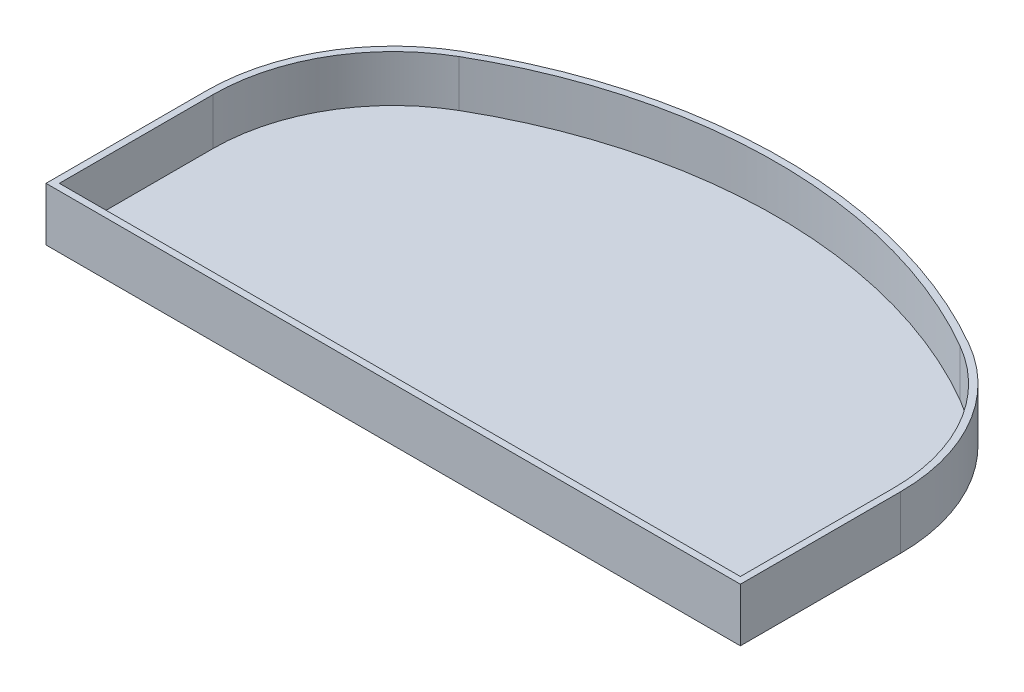
ISO-10303-21;
HEADER;
FILE_DESCRIPTION(('STEP AP214'),'2;1');
FILE_NAME('part.step','',(''),(''),'','','');
FILE_SCHEMA(('AUTOMOTIVE_DESIGN { 1 0 10303 214 1 1 1 1 }'));
ENDSEC;
DATA;
#1=APPLICATION_CONTEXT('core data for automotive mechanical design processes');
#2=APPLICATION_PROTOCOL_DEFINITION('international standard','automotive_design',2000,#1);
#3=PRODUCT_CONTEXT('',#1,'mechanical');
#4=PRODUCT('Part','Part','',(#3));
#5=PRODUCT_RELATED_PRODUCT_CATEGORY('part','',(#4));
#6=PRODUCT_DEFINITION_FORMATION('','',#4);
#7=PRODUCT_DEFINITION_CONTEXT('part definition',#1,'design');
#8=PRODUCT_DEFINITION('design','',#6,#7);
#9=PRODUCT_DEFINITION_SHAPE('','',#8);
#10=(LENGTH_UNIT() NAMED_UNIT(*) SI_UNIT(.MILLI.,.METRE.));
#11=(NAMED_UNIT(*) PLANE_ANGLE_UNIT() SI_UNIT($,.RADIAN.));
#12=(NAMED_UNIT(*) SI_UNIT($,.STERADIAN.) SOLID_ANGLE_UNIT());
#13=UNCERTAINTY_MEASURE_WITH_UNIT(LENGTH_MEASURE(1.E-05),#10,'distance_accuracy_value','');
#14=(GEOMETRIC_REPRESENTATION_CONTEXT(3) GLOBAL_UNCERTAINTY_ASSIGNED_CONTEXT((#13)) GLOBAL_UNIT_ASSIGNED_CONTEXT((#10,
#11,#12)) REPRESENTATION_CONTEXT('',''));
#15=CARTESIAN_POINT('',(0.,0.,0.));
#16=DIRECTION('',(0.,0.,1.));
#17=DIRECTION('',(1.,0.,0.));
#18=AXIS2_PLACEMENT_3D('',#15,#16,#17);
#19=CARTESIAN_POINT('',(0.,25.4,0.));
#20=DIRECTION('',(1.,0.,0.));
#21=DIRECTION('',(0.,0.,-1.));
#22=AXIS2_PLACEMENT_3D('',#19,#20,#21);
#23=PLANE('',#22);
#24=DIRECTION('',(0.,0.,1.));
#25=VECTOR('',#24,1.);
#26=CARTESIAN_POINT('',(0.,0.,0.));
#27=LINE('',#26,#25);
#28=CARTESIAN_POINT('',(0.,0.,-76.2));
#29=VERTEX_POINT('',#28);
#30=CARTESIAN_POINT('',(0.,0.,0.));
#31=VERTEX_POINT('',#30);
#32=EDGE_CURVE('E139',#29,#31,#27,.T.);
#33=ORIENTED_EDGE('',*,*,#32,.T.);
#34=DIRECTION('',(0.,-1.,0.));
#35=VECTOR('',#34,1.);
#36=CARTESIAN_POINT('',(0.,25.4,0.));
#37=LINE('',#36,#35);
#38=CARTESIAN_POINT('',(0.,25.4,0.));
#39=VERTEX_POINT('',#38);
#40=EDGE_CURVE('E11',#39,#31,#37,.T.);
#41=ORIENTED_EDGE('',*,*,#40,.F.);
#42=DIRECTION('',(0.,0.,1.));
#43=VECTOR('',#42,1.);
#44=CARTESIAN_POINT('',(0.,25.4,0.));
#45=LINE('',#44,#43);
#46=CARTESIAN_POINT('',(0.,25.4,-76.2));
#47=VERTEX_POINT('',#46);
#48=EDGE_CURVE('E157',#47,#39,#45,.T.);
#49=ORIENTED_EDGE('',*,*,#48,.F.);
#50=DIRECTION('',(0.,-1.,0.));
#51=VECTOR('',#50,1.);
#52=CARTESIAN_POINT('',(0.,25.4,-76.2));
#53=LINE('',#52,#51);
#54=EDGE_CURVE('E135',#47,#29,#53,.T.);
#55=ORIENTED_EDGE('',*,*,#54,.T.);
#56=EDGE_LOOP('',(#33,#41,#49,#55));
#57=FACE_BOUND('',#56,.T.);
#58=ADVANCED_FACE('F39',(#57),#23,.F.);
#59=CARTESIAN_POINT('',(0.,25.4,0.));
#60=DIRECTION('',(0.,0.,-1.));
#61=DIRECTION('',(-1.,0.,0.));
#62=AXIS2_PLACEMENT_3D('',#59,#60,#61);
#63=PLANE('',#62);
#64=DIRECTION('',(1.,0.,0.));
#65=VECTOR('',#64,1.);
#66=CARTESIAN_POINT('',(0.,0.,0.));
#67=LINE('',#66,#65);
#68=CARTESIAN_POINT('',(330.2,0.,0.));
#69=VERTEX_POINT('',#68);
#70=EDGE_CURVE('E143',#31,#69,#67,.T.);
#71=ORIENTED_EDGE('',*,*,#70,.T.);
#72=DIRECTION('',(0.,-1.,0.));
#73=VECTOR('',#72,1.);
#74=CARTESIAN_POINT('',(330.2,25.4,0.));
#75=LINE('',#74,#73);
#76=CARTESIAN_POINT('',(330.2,25.4,0.));
#77=VERTEX_POINT('',#76);
#78=EDGE_CURVE('E47',#77,#69,#75,.T.);
#79=ORIENTED_EDGE('',*,*,#78,.F.);
#80=DIRECTION('',(1.,0.,0.));
#81=VECTOR('',#80,1.);
#82=CARTESIAN_POINT('',(0.,25.4,0.));
#83=LINE('',#82,#81);
#84=EDGE_CURVE('E98',#39,#77,#83,.T.);
#85=ORIENTED_EDGE('',*,*,#84,.F.);
#86=ORIENTED_EDGE('',*,*,#40,.T.);
#87=EDGE_LOOP('',(#71,#79,#85,#86));
#88=FACE_BOUND('',#87,.T.);
#89=ADVANCED_FACE('F305',(#88),#63,.F.);
#90=CARTESIAN_POINT('',(330.2,25.4,-76.2));
#91=DIRECTION('',(-1.,0.,0.));
#92=DIRECTION('',(0.,0.,1.));
#93=AXIS2_PLACEMENT_3D('',#90,#91,#92);
#94=PLANE('',#93);
#95=DIRECTION('',(0.,0.,-1.));
#96=VECTOR('',#95,1.);
#97=CARTESIAN_POINT('',(330.2,0.,-76.2));
#98=LINE('',#97,#96);
#99=CARTESIAN_POINT('',(330.2,0.,-76.2));
#100=VERTEX_POINT('',#99);
#101=EDGE_CURVE('E147',#69,#100,#98,.T.);
#102=ORIENTED_EDGE('',*,*,#101,.T.);
#103=DIRECTION('',(0.,-1.,0.));
#104=VECTOR('',#103,1.);
#105=CARTESIAN_POINT('',(330.2,25.4,-76.2));
#106=LINE('',#105,#104);
#107=CARTESIAN_POINT('',(330.2,25.4,-76.2));
#108=VERTEX_POINT('',#107);
#109=EDGE_CURVE('E128',#108,#100,#106,.T.);
#110=ORIENTED_EDGE('',*,*,#109,.F.);
#111=DIRECTION('',(0.,0.,-1.));
#112=VECTOR('',#111,1.);
#113=CARTESIAN_POINT('',(330.2,25.4,-76.2));
#114=LINE('',#113,#112);
#115=EDGE_CURVE('E114',#77,#108,#114,.T.);
#116=ORIENTED_EDGE('',*,*,#115,.F.);
#117=ORIENTED_EDGE('',*,*,#78,.T.);
#118=EDGE_LOOP('',(#102,#110,#116,#117));
#119=FACE_BOUND('',#118,.T.);
#120=ADVANCED_FACE('F167',(#119),#94,.F.);
#121=CARTESIAN_POINT('',(241.3,25.4,-76.2));
#122=DIRECTION('',(0.,-1.,0.));
#123=DIRECTION('',(0.,0.,-1.));
#124=AXIS2_PLACEMENT_3D('',#121,#122,#123);
#125=CYLINDRICAL_SURFACE('',#124,88.9);
#126=CARTESIAN_POINT('',(241.3,0.,-76.2));
#127=DIRECTION('',(0.,1.,0.));
#128=DIRECTION('',(0.,0.,-1.));
#129=AXIS2_PLACEMENT_3D('',#126,#127,#128);
#130=CIRCLE('',#129,88.9);
#131=CARTESIAN_POINT('',(285.75,0.,-153.189658396437));
#132=VERTEX_POINT('',#131);
#133=EDGE_CURVE('E124',#100,#132,#130,.T.);
#134=ORIENTED_EDGE('',*,*,#133,.T.);
#135=DIRECTION('',(0.,-1.,0.));
#136=VECTOR('',#135,1.);
#137=CARTESIAN_POINT('',(285.75,25.4,-153.189658396437));
#138=LINE('',#137,#136);
#139=CARTESIAN_POINT('',(285.75,25.4,-153.189658396437));
#140=VERTEX_POINT('',#139);
#141=EDGE_CURVE('E121',#140,#132,#138,.T.);
#142=ORIENTED_EDGE('',*,*,#141,.F.);
#143=CARTESIAN_POINT('',(241.3,25.4,-76.2));
#144=DIRECTION('',(0.,1.,0.));
#145=DIRECTION('',(0.,0.,-1.));
#146=AXIS2_PLACEMENT_3D('',#143,#144,#145);
#147=CIRCLE('',#146,88.9);
#148=EDGE_CURVE('E107',#108,#140,#147,.T.);
#149=ORIENTED_EDGE('',*,*,#148,.F.);
#150=ORIENTED_EDGE('',*,*,#109,.T.);
#151=EDGE_LOOP('',(#134,#142,#149,#150));
#152=FACE_BOUND('',#151,.T.);
#153=ADVANCED_FACE('F122',(#152),#125,.T.);
#154=CARTESIAN_POINT('',(165.1,25.4,55.7822715367499));
#155=DIRECTION('',(0.,-1.,0.));
#156=DIRECTION('',(0.,0.,-1.));
#157=AXIS2_PLACEMENT_3D('',#154,#155,#156);
#158=CYLINDRICAL_SURFACE('',#157,241.300000000001);
#159=CARTESIAN_POINT('',(165.1,0.,55.7822715367499));
#160=DIRECTION('',(0.,1.,0.));
#161=DIRECTION('',(0.,0.,-1.));
#162=AXIS2_PLACEMENT_3D('',#159,#160,#161);
#163=CIRCLE('',#162,241.300000000001);
#164=CARTESIAN_POINT('',(44.4500000000004,0.,-153.189658396437));
#165=VERTEX_POINT('',#164);
#166=EDGE_CURVE('E152',#132,#165,#163,.T.);
#167=ORIENTED_EDGE('',*,*,#166,.T.);
#168=DIRECTION('',(0.,-1.,0.));
#169=VECTOR('',#168,1.);
#170=CARTESIAN_POINT('',(44.4500000000004,25.4,-153.189658396437));
#171=LINE('',#170,#169);
#172=CARTESIAN_POINT('',(44.4500000000004,25.4,-153.189658396437));
#173=VERTEX_POINT('',#172);
#174=EDGE_CURVE('E129',#173,#165,#171,.T.);
#175=ORIENTED_EDGE('',*,*,#174,.F.);
#176=CARTESIAN_POINT('',(165.1,25.4,55.7822715367499));
#177=DIRECTION('',(0.,1.,0.));
#178=DIRECTION('',(0.,0.,-1.));
#179=AXIS2_PLACEMENT_3D('',#176,#177,#178);
#180=CIRCLE('',#179,241.300000000001);
#181=EDGE_CURVE('E111',#140,#173,#180,.T.);
#182=ORIENTED_EDGE('',*,*,#181,.F.);
#183=ORIENTED_EDGE('',*,*,#141,.T.);
#184=EDGE_LOOP('',(#167,#175,#182,#183));
#185=FACE_BOUND('',#184,.T.);
#186=ADVANCED_FACE('F131',(#185),#158,.T.);
#187=CARTESIAN_POINT('',(88.9,25.4,-76.2));
#188=DIRECTION('',(0.,-1.,0.));
#189=DIRECTION('',(0.,0.,-1.));
#190=AXIS2_PLACEMENT_3D('',#187,#188,#189);
#191=CYLINDRICAL_SURFACE('',#190,88.9);
#192=CARTESIAN_POINT('',(88.9,0.,-76.2));
#193=DIRECTION('',(0.,1.,0.));
#194=DIRECTION('',(0.,0.,-1.));
#195=AXIS2_PLACEMENT_3D('',#192,#193,#194);
#196=CIRCLE('',#195,88.9);
#197=EDGE_CURVE('E90',#165,#29,#196,.T.);
#198=ORIENTED_EDGE('',*,*,#197,.T.);
#199=ORIENTED_EDGE('',*,*,#54,.F.);
#200=CARTESIAN_POINT('',(88.9,25.4,-76.2));
#201=DIRECTION('',(0.,1.,0.));
#202=DIRECTION('',(0.,0.,-1.));
#203=AXIS2_PLACEMENT_3D('',#200,#201,#202);
#204=CIRCLE('',#203,88.9);
#205=EDGE_CURVE('E63',#173,#47,#204,.T.);
#206=ORIENTED_EDGE('',*,*,#205,.F.);
#207=ORIENTED_EDGE('',*,*,#174,.T.);
#208=EDGE_LOOP('',(#198,#199,#206,#207));
#209=FACE_BOUND('',#208,.T.);
#210=ADVANCED_FACE('F171',(#209),#191,.T.);
#211=CARTESIAN_POINT('',(88.9,25.4,-76.2));
#212=DIRECTION('',(0.,-1.,0.));
#213=DIRECTION('',(0.,0.,-1.));
#214=AXIS2_PLACEMENT_3D('',#211,#212,#213);
#215=PLANE('',#214);
#216=DIRECTION('',(0.,0.,1.));
#217=VECTOR('',#216,1.);
#218=CARTESIAN_POINT('',(3.175,25.4,-76.2));
#219=LINE('',#218,#217);
#220=CARTESIAN_POINT('',(3.17500000000003,25.4,-76.2));
#221=VERTEX_POINT('',#220);
#222=CARTESIAN_POINT('',(3.175,25.4,-3.175));
#223=VERTEX_POINT('',#222);
#224=EDGE_CURVE('E200',#221,#223,#219,.T.);
#225=ORIENTED_EDGE('',*,*,#224,.F.);
#226=CARTESIAN_POINT('',(88.9,25.4,-76.2));
#227=DIRECTION('',(0.,-1.,0.));
#228=DIRECTION('',(0.,0.,-1.));
#229=AXIS2_PLACEMENT_3D('',#226,#227,#228);
#230=CIRCLE('',#229,85.725);
#231=CARTESIAN_POINT('',(46.0375000000004,25.4,-150.440027739421));
#232=VERTEX_POINT('',#231);
#233=EDGE_CURVE('E180',#232,#221,#230,.F.);
#234=ORIENTED_EDGE('',*,*,#233,.F.);
#235=CARTESIAN_POINT('',(165.1,25.4,55.7822715367499));
#236=DIRECTION('',(0.,-1.,0.));
#237=DIRECTION('',(0.,0.,-1.));
#238=AXIS2_PLACEMENT_3D('',#235,#236,#237);
#239=CIRCLE('',#238,238.125000000001);
#240=CARTESIAN_POINT('',(284.1625,25.4,-150.440027739421));
#241=VERTEX_POINT('',#240);
#242=EDGE_CURVE('E185',#241,#232,#239,.F.);
#243=ORIENTED_EDGE('',*,*,#242,.F.);
#244=CARTESIAN_POINT('',(241.3,25.4,-76.2));
#245=DIRECTION('',(0.,-1.,0.));
#246=DIRECTION('',(0.,0.,-1.));
#247=AXIS2_PLACEMENT_3D('',#244,#245,#246);
#248=CIRCLE('',#247,85.725);
#249=CARTESIAN_POINT('',(327.025,25.4,-76.2));
#250=VERTEX_POINT('',#249);
#251=EDGE_CURVE('E188',#250,#241,#248,.F.);
#252=ORIENTED_EDGE('',*,*,#251,.F.);
#253=DIRECTION('',(0.,0.,-1.));
#254=VECTOR('',#253,1.);
#255=CARTESIAN_POINT('',(327.025,25.4,-76.2));
#256=LINE('',#255,#254);
#257=CARTESIAN_POINT('',(327.025,25.4,-3.175));
#258=VERTEX_POINT('',#257);
#259=EDGE_CURVE('E192',#258,#250,#256,.T.);
#260=ORIENTED_EDGE('',*,*,#259,.F.);
#261=DIRECTION('',(1.,0.,0.));
#262=VECTOR('',#261,1.);
#263=CARTESIAN_POINT('',(88.9,25.4,-3.175));
#264=LINE('',#263,#262);
#265=EDGE_CURVE('E196',#223,#258,#264,.T.);
#266=ORIENTED_EDGE('',*,*,#265,.F.);
#267=EDGE_LOOP('',(#225,#234,#243,#252,#260,#266));
#268=FACE_BOUND('',#267,.T.);
#269=ORIENTED_EDGE('',*,*,#48,.T.);
#270=ORIENTED_EDGE('',*,*,#84,.T.);
#271=ORIENTED_EDGE('',*,*,#115,.T.);
#272=ORIENTED_EDGE('',*,*,#148,.T.);
#273=ORIENTED_EDGE('',*,*,#181,.T.);
#274=ORIENTED_EDGE('',*,*,#205,.T.);
#275=EDGE_LOOP('',(#269,#270,#271,#272,#273,#274));
#276=FACE_BOUND('',#275,.T.);
#277=ADVANCED_FACE('F109',(#268,#276),#215,.F.);
#278=CARTESIAN_POINT('',(88.9,0.,-76.2));
#279=DIRECTION('',(0.,-1.,0.));
#280=DIRECTION('',(0.,0.,-1.));
#281=AXIS2_PLACEMENT_3D('',#278,#279,#280);
#282=PLANE('',#281);
#283=ORIENTED_EDGE('',*,*,#32,.F.);
#284=ORIENTED_EDGE('',*,*,#197,.F.);
#285=ORIENTED_EDGE('',*,*,#166,.F.);
#286=ORIENTED_EDGE('',*,*,#133,.F.);
#287=ORIENTED_EDGE('',*,*,#101,.F.);
#288=ORIENTED_EDGE('',*,*,#70,.F.);
#289=EDGE_LOOP('',(#283,#284,#285,#286,#287,#288));
#290=FACE_BOUND('',#289,.T.);
#291=ADVANCED_FACE('F170',(#290),#282,.T.);
#292=CARTESIAN_POINT('',(3.175,25.4,0.));
#293=DIRECTION('',(1.,0.,0.));
#294=DIRECTION('',(0.,0.,-1.));
#295=AXIS2_PLACEMENT_3D('',#292,#293,#294);
#296=PLANE('',#295);
#297=DIRECTION('',(0.,0.,1.));
#298=VECTOR('',#297,1.);
#299=CARTESIAN_POINT('',(3.175,3.175,-76.2));
#300=LINE('',#299,#298);
#301=CARTESIAN_POINT('',(3.175,3.175,-76.2));
#302=VERTEX_POINT('',#301);
#303=CARTESIAN_POINT('',(3.175,3.175,-3.175));
#304=VERTEX_POINT('',#303);
#305=EDGE_CURVE('E238',#302,#304,#300,.T.);
#306=ORIENTED_EDGE('',*,*,#305,.F.);
#307=DIRECTION('',(0.,1.,0.));
#308=VECTOR('',#307,1.);
#309=CARTESIAN_POINT('',(3.175,25.4,-76.2));
#310=LINE('',#309,#308);
#311=EDGE_CURVE('E184',#221,#302,#310,.F.);
#312=ORIENTED_EDGE('',*,*,#311,.F.);
#313=ORIENTED_EDGE('',*,*,#224,.T.);
#314=DIRECTION('',(0.,-1.,0.));
#315=VECTOR('',#314,1.);
#316=CARTESIAN_POINT('',(3.175,25.4,-3.175));
#317=LINE('',#316,#315);
#318=EDGE_CURVE('E144',#223,#304,#317,.T.);
#319=ORIENTED_EDGE('',*,*,#318,.T.);
#320=EDGE_LOOP('',(#306,#312,#313,#319));
#321=FACE_BOUND('',#320,.T.);
#322=ADVANCED_FACE('F257',(#321),#296,.T.);
#323=CARTESIAN_POINT('',(0.,25.4,-3.175));
#324=DIRECTION('',(0.,0.,-1.));
#325=DIRECTION('',(-1.,0.,0.));
#326=AXIS2_PLACEMENT_3D('',#323,#324,#325);
#327=PLANE('',#326);
#328=DIRECTION('',(1.,0.,0.));
#329=VECTOR('',#328,1.);
#330=CARTESIAN_POINT('',(88.9,3.175,-3.175));
#331=LINE('',#330,#329);
#332=CARTESIAN_POINT('',(327.025,3.175,-3.175));
#333=VERTEX_POINT('',#332);
#334=EDGE_CURVE('E231',#304,#333,#331,.T.);
#335=ORIENTED_EDGE('',*,*,#334,.F.);
#336=ORIENTED_EDGE('',*,*,#318,.F.);
#337=ORIENTED_EDGE('',*,*,#265,.T.);
#338=DIRECTION('',(0.,-1.,0.));
#339=VECTOR('',#338,1.);
#340=CARTESIAN_POINT('',(327.025,25.4,-3.175));
#341=LINE('',#340,#339);
#342=EDGE_CURVE('E227',#258,#333,#341,.T.);
#343=ORIENTED_EDGE('',*,*,#342,.T.);
#344=EDGE_LOOP('',(#335,#336,#337,#343));
#345=FACE_BOUND('',#344,.T.);
#346=ADVANCED_FACE('F283',(#345),#327,.T.);
#347=CARTESIAN_POINT('',(327.025,25.4,-76.2));
#348=DIRECTION('',(-1.,0.,0.));
#349=DIRECTION('',(0.,0.,1.));
#350=AXIS2_PLACEMENT_3D('',#347,#348,#349);
#351=PLANE('',#350);
#352=DIRECTION('',(0.,0.,-1.));
#353=VECTOR('',#352,1.);
#354=CARTESIAN_POINT('',(327.025,3.175,-76.2));
#355=LINE('',#354,#353);
#356=CARTESIAN_POINT('',(327.025,3.175,-76.2));
#357=VERTEX_POINT('',#356);
#358=EDGE_CURVE('E223',#333,#357,#355,.T.);
#359=ORIENTED_EDGE('',*,*,#358,.F.);
#360=ORIENTED_EDGE('',*,*,#342,.F.);
#361=ORIENTED_EDGE('',*,*,#259,.T.);
#362=DIRECTION('',(0.,-1.,0.));
#363=VECTOR('',#362,1.);
#364=CARTESIAN_POINT('',(327.025,25.4,-76.2));
#365=LINE('',#364,#363);
#366=EDGE_CURVE('E219',#250,#357,#365,.T.);
#367=ORIENTED_EDGE('',*,*,#366,.T.);
#368=EDGE_LOOP('',(#359,#360,#361,#367));
#369=FACE_BOUND('',#368,.T.);
#370=ADVANCED_FACE('F289',(#369),#351,.T.);
#371=CARTESIAN_POINT('',(241.3,25.4,-76.2));
#372=DIRECTION('',(0.,-1.,0.));
#373=DIRECTION('',(0.,0.,-1.));
#374=AXIS2_PLACEMENT_3D('',#371,#372,#373);
#375=CYLINDRICAL_SURFACE('',#374,85.725);
#376=CARTESIAN_POINT('',(241.3,3.175,-76.2));
#377=DIRECTION('',(0.,-1.,0.));
#378=DIRECTION('',(0.,0.,-1.));
#379=AXIS2_PLACEMENT_3D('',#376,#377,#378);
#380=CIRCLE('',#379,85.725);
#381=CARTESIAN_POINT('',(284.1625,3.175,-150.440027739421));
#382=VERTEX_POINT('',#381);
#383=EDGE_CURVE('E215',#357,#382,#380,.F.);
#384=ORIENTED_EDGE('',*,*,#383,.F.);
#385=ORIENTED_EDGE('',*,*,#366,.F.);
#386=ORIENTED_EDGE('',*,*,#251,.T.);
#387=DIRECTION('',(0.,-1.,0.));
#388=VECTOR('',#387,1.);
#389=CARTESIAN_POINT('',(284.1625,25.4,-150.440027739421));
#390=LINE('',#389,#388);
#391=EDGE_CURVE('E211',#241,#382,#390,.T.);
#392=ORIENTED_EDGE('',*,*,#391,.T.);
#393=EDGE_LOOP('',(#384,#385,#386,#392));
#394=FACE_BOUND('',#393,.T.);
#395=ADVANCED_FACE('F293',(#394),#375,.F.);
#396=CARTESIAN_POINT('',(165.1,25.4,55.7822715367499));
#397=DIRECTION('',(0.,-1.,0.));
#398=DIRECTION('',(0.,0.,-1.));
#399=AXIS2_PLACEMENT_3D('',#396,#397,#398);
#400=CYLINDRICAL_SURFACE('',#399,238.125000000001);
#401=CARTESIAN_POINT('',(165.1,3.175,55.7822715367499));
#402=DIRECTION('',(0.,-1.,0.));
#403=DIRECTION('',(0.,0.,-1.));
#404=AXIS2_PLACEMENT_3D('',#401,#402,#403);
#405=CIRCLE('',#404,238.125000000001);
#406=CARTESIAN_POINT('',(46.0375000000004,3.175,-150.440027739421));
#407=VERTEX_POINT('',#406);
#408=EDGE_CURVE('E208',#382,#407,#405,.F.);
#409=ORIENTED_EDGE('',*,*,#408,.F.);
#410=ORIENTED_EDGE('',*,*,#391,.F.);
#411=ORIENTED_EDGE('',*,*,#242,.T.);
#412=DIRECTION('',(0.,-1.,0.));
#413=VECTOR('',#412,1.);
#414=CARTESIAN_POINT('',(46.0375000000004,25.4,-150.440027739421));
#415=LINE('',#414,#413);
#416=EDGE_CURVE('E54',#232,#407,#415,.T.);
#417=ORIENTED_EDGE('',*,*,#416,.T.);
#418=EDGE_LOOP('',(#409,#410,#411,#417));
#419=FACE_BOUND('',#418,.T.);
#420=ADVANCED_FACE('F295',(#419),#400,.F.);
#421=CARTESIAN_POINT('',(88.9,25.4,-76.2));
#422=DIRECTION('',(0.,-1.,0.));
#423=DIRECTION('',(0.,0.,-1.));
#424=AXIS2_PLACEMENT_3D('',#421,#422,#423);
#425=CYLINDRICAL_SURFACE('',#424,85.725);
#426=CARTESIAN_POINT('',(88.9,3.175,-76.2));
#427=DIRECTION('',(0.,-1.,0.));
#428=DIRECTION('',(0.,0.,-1.));
#429=AXIS2_PLACEMENT_3D('',#426,#427,#428);
#430=CIRCLE('',#429,85.725);
#431=EDGE_CURVE('E204',#407,#302,#430,.F.);
#432=ORIENTED_EDGE('',*,*,#431,.F.);
#433=ORIENTED_EDGE('',*,*,#416,.F.);
#434=ORIENTED_EDGE('',*,*,#233,.T.);
#435=ORIENTED_EDGE('',*,*,#311,.T.);
#436=EDGE_LOOP('',(#432,#433,#434,#435));
#437=FACE_BOUND('',#436,.T.);
#438=ADVANCED_FACE('F277',(#437),#425,.F.);
#439=CARTESIAN_POINT('',(88.9,3.175,-76.2));
#440=DIRECTION('',(0.,-1.,0.));
#441=DIRECTION('',(0.,0.,-1.));
#442=AXIS2_PLACEMENT_3D('',#439,#440,#441);
#443=PLANE('',#442);
#444=ORIENTED_EDGE('',*,*,#305,.T.);
#445=ORIENTED_EDGE('',*,*,#334,.T.);
#446=ORIENTED_EDGE('',*,*,#358,.T.);
#447=ORIENTED_EDGE('',*,*,#383,.T.);
#448=ORIENTED_EDGE('',*,*,#408,.T.);
#449=ORIENTED_EDGE('',*,*,#431,.T.);
#450=EDGE_LOOP('',(#444,#445,#446,#447,#448,#449));
#451=FACE_BOUND('',#450,.T.);
#452=ADVANCED_FACE('F250',(#451),#443,.F.);
#453=CLOSED_SHELL('',(#58,#89,#120,#153,#186,#210,#277,#291,#322,#346,#370,#395,#420,#438,#452));
#454=MANIFOLD_SOLID_BREP('B2',#453);
#455=ADVANCED_BREP_SHAPE_REPRESENTATION('',(#18,#454),#14);
#456=SHAPE_DEFINITION_REPRESENTATION(#9,#455);
ENDSEC;
END-ISO-10303-21;
